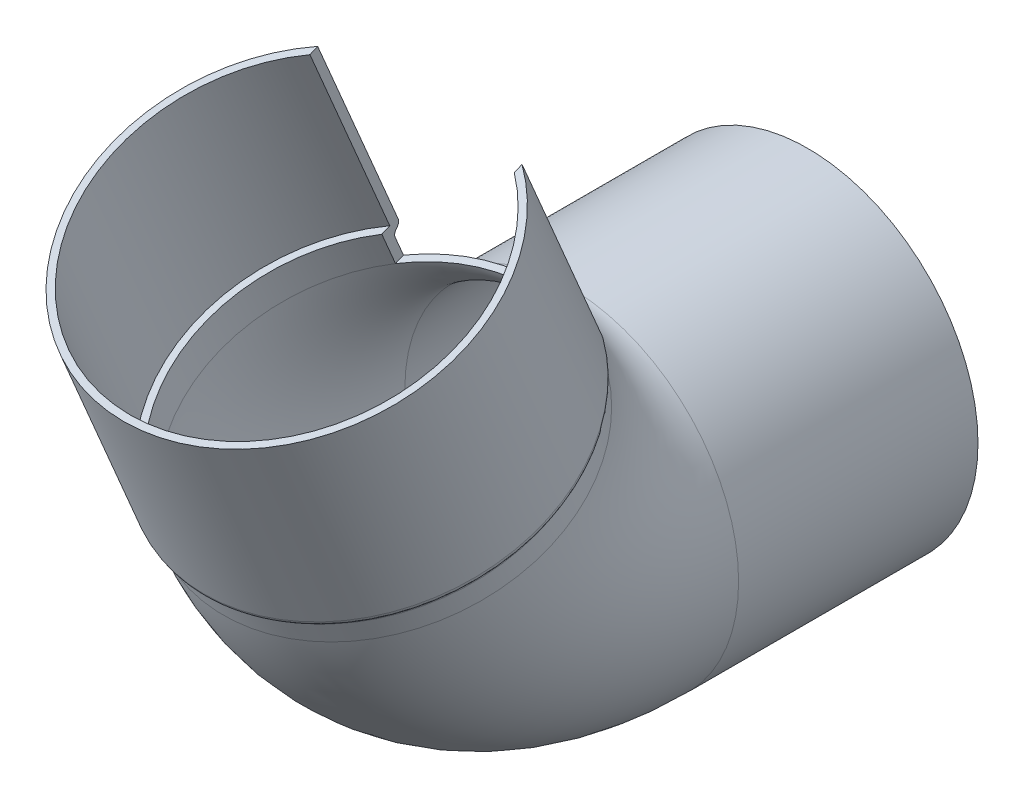
ISO-10303-21;
HEADER;
FILE_DESCRIPTION(('STEP AP214'),'2;1');
FILE_NAME('part.step','',(''),(''),'','','');
FILE_SCHEMA(('AUTOMOTIVE_DESIGN { 1 0 10303 214 1 1 1 1 }'));
ENDSEC;
DATA;
#1=APPLICATION_CONTEXT('core data for automotive mechanical design processes');
#2=APPLICATION_PROTOCOL_DEFINITION('international standard','automotive_design',2000,#1);
#3=PRODUCT_CONTEXT('',#1,'mechanical');
#4=PRODUCT('Part','Part','',(#3));
#5=PRODUCT_RELATED_PRODUCT_CATEGORY('part','',(#4));
#6=PRODUCT_DEFINITION_FORMATION('','',#4);
#7=PRODUCT_DEFINITION_CONTEXT('part definition',#1,'design');
#8=PRODUCT_DEFINITION('design','',#6,#7);
#9=PRODUCT_DEFINITION_SHAPE('','',#8);
#10=(LENGTH_UNIT() NAMED_UNIT(*) SI_UNIT(.MILLI.,.METRE.));
#11=(NAMED_UNIT(*) PLANE_ANGLE_UNIT() SI_UNIT($,.RADIAN.));
#12=(NAMED_UNIT(*) SI_UNIT($,.STERADIAN.) SOLID_ANGLE_UNIT());
#13=UNCERTAINTY_MEASURE_WITH_UNIT(LENGTH_MEASURE(1.E-05),#10,'distance_accuracy_value','');
#14=(GEOMETRIC_REPRESENTATION_CONTEXT(3) GLOBAL_UNCERTAINTY_ASSIGNED_CONTEXT((#13)) GLOBAL_UNIT_ASSIGNED_CONTEXT((#10,
#11,#12)) REPRESENTATION_CONTEXT('',''));
#15=CARTESIAN_POINT('',(0.,0.,0.));
#16=DIRECTION('',(0.,0.,1.));
#17=DIRECTION('',(1.,0.,0.));
#18=AXIS2_PLACEMENT_3D('',#15,#16,#17);
#19=CARTESIAN_POINT('',(0.,18.2780661453218,62.7585787677024));
#20=DIRECTION('',(0.,0.920504853452442,0.390731128489271));
#21=DIRECTION('',(0.,-0.390731128489271,0.920504853452442));
#22=AXIS2_PLACEMENT_3D('',#19,#20,#21);
#23=CYLINDRICAL_SURFACE('',#22,25.);
#24=CARTESIAN_POINT('',(0.,21.1716116294062,63.9868159552533));
#25=DIRECTION('',(0.,0.920504853452441,0.390731128489272));
#26=DIRECTION('',(0.,-0.390731128489272,0.920504853452441));
#27=AXIS2_PLACEMENT_3D('',#24,#25,#26);
#28=CIRCLE('',#27,25.);
#29=CARTESIAN_POINT('',(15.,28.9862341991916,45.5767188862044));
#30=VERTEX_POINT('',#29);
#31=CARTESIAN_POINT('',(-15.,28.9862341991877,45.5767188862139));
#32=VERTEX_POINT('',#31);
#33=EDGE_CURVE('E174',#30,#32,#28,.F.);
#34=ORIENTED_EDGE('',*,*,#33,.T.);
#35=DIRECTION('',(0.,0.920504853452442,0.390731128489271));
#36=VECTOR('',#35,1.);
#37=CARTESIAN_POINT('',(-15.,26.0926887151073,44.3484816986536));
#38=LINE('',#37,#36);
#39=CARTESIAN_POINT('',(-15.,26.0926887151073,44.3484816986536));
#40=VERTEX_POINT('',#39);
#41=EDGE_CURVE('E269',#32,#40,#38,.F.);
#42=ORIENTED_EDGE('',*,*,#41,.T.);
#43=CARTESIAN_POINT('',(0.,18.2780661453218,62.7585787677024));
#44=DIRECTION('',(0.,0.920504853452441,0.390731128489272));
#45=DIRECTION('',(1.,0.,0.));
#46=AXIS2_PLACEMENT_3D('',#43,#44,#45);
#47=CIRCLE('',#46,25.);
#48=CARTESIAN_POINT('',(15.,26.0926887151073,44.3484816986536));
#49=VERTEX_POINT('',#48);
#50=EDGE_CURVE('E167',#40,#49,#47,.T.);
#51=ORIENTED_EDGE('',*,*,#50,.T.);
#52=DIRECTION('',(0.,0.920504853452442,0.390731128489271));
#53=VECTOR('',#52,1.);
#54=CARTESIAN_POINT('',(15.,26.0926887151073,44.3484816986536));
#55=LINE('',#54,#53);
#56=EDGE_CURVE('E128',#49,#30,#55,.T.);
#57=ORIENTED_EDGE('',*,*,#56,.T.);
#58=EDGE_LOOP('',(#34,#42,#51,#57));
#59=FACE_BOUND('',#58,.T.);
#60=ADVANCED_FACE('F45',(#59),#23,.T.);
#61=CARTESIAN_POINT('',(0.,18.2780661453218,62.7585787677024));
#62=DIRECTION('',(0.,0.920504853452442,0.390731128489271));
#63=DIRECTION('',(0.,-0.390731128489271,0.920504853452442));
#64=AXIS2_PLACEMENT_3D('',#61,#62,#63);
#65=CYLINDRICAL_SURFACE('',#64,24.);
#66=DIRECTION('',(0.,0.920504853452442,0.390731128489271));
#67=VECTOR('',#66,1.);
#68=CARTESIAN_POINT('',(-15.,25.5984114913042,45.5129258657229));
#69=LINE('',#68,#67);
#70=CARTESIAN_POINT('',(-15.,30.3329666822934,47.5226253102523));
#71=VERTEX_POINT('',#70);
#72=CARTESIAN_POINT('',(-15.,25.5984114913042,45.5129258657229));
#73=VERTEX_POINT('',#72);
#74=EDGE_CURVE('E144',#71,#73,#69,.F.);
#75=ORIENTED_EDGE('',*,*,#74,.F.);
#76=CARTESIAN_POINT('',(0.,23.012621336311,64.7682782122318));
#77=DIRECTION('',(0.,0.920504853452441,0.390731128489272));
#78=DIRECTION('',(0.,-0.390731128489272,0.920504853452441));
#79=AXIS2_PLACEMENT_3D('',#76,#77,#78);
#80=CIRCLE('',#79,24.);
#81=CARTESIAN_POINT('',(15.,30.3329666822934,47.5226253102523));
#82=VERTEX_POINT('',#81);
#83=EDGE_CURVE('E146',#71,#82,#80,.T.);
#84=ORIENTED_EDGE('',*,*,#83,.T.);
#85=DIRECTION('',(0.,0.920504853452442,0.390731128489271));
#86=VECTOR('',#85,1.);
#87=CARTESIAN_POINT('',(15.,25.5984114913042,45.5129258657229));
#88=LINE('',#87,#86);
#89=CARTESIAN_POINT('',(15.,25.5984114913042,45.5129258657229));
#90=VERTEX_POINT('',#89);
#91=EDGE_CURVE('E214',#90,#82,#88,.T.);
#92=ORIENTED_EDGE('',*,*,#91,.F.);
#93=CARTESIAN_POINT('',(0.,18.2780661453218,62.7585787677024));
#94=DIRECTION('',(0.,0.920504853452442,0.390731128489271));
#95=DIRECTION('',(0.,-0.390731128489271,0.920504853452442));
#96=AXIS2_PLACEMENT_3D('',#93,#94,#95);
#97=CIRCLE('',#96,24.);
#98=EDGE_CURVE('E158',#73,#90,#97,.T.);
#99=ORIENTED_EDGE('',*,*,#98,.F.);
#100=EDGE_LOOP('',(#75,#84,#92,#99));
#101=FACE_BOUND('',#100,.T.);
#102=ADVANCED_FACE('F229',(#101),#65,.F.);
#103=CARTESIAN_POINT('',(0.,23.012621336311,64.7682782122318));
#104=DIRECTION('',(0.,0.920504853452441,0.390731128489272));
#105=DIRECTION('',(0.,-0.390731128489272,0.920504853452441));
#106=AXIS2_PLACEMENT_3D('',#103,#104,#105);
#107=PLANE('',#106);
#108=ORIENTED_EDGE('',*,*,#83,.F.);
#109=DIRECTION('',(0.,0.390731128489272,-0.920504853452441));
#110=VECTOR('',#109,1.);
#111=CARTESIAN_POINT('',(-15.,23.012621336311,64.7682782122318));
#112=LINE('',#111,#110);
#113=CARTESIAN_POINT('',(-15.,30.8272439060965,46.3581811431829));
#114=VERTEX_POINT('',#113);
#115=EDGE_CURVE('E72',#71,#114,#112,.T.);
#116=ORIENTED_EDGE('',*,*,#115,.T.);
#117=CARTESIAN_POINT('',(0.,23.0126213363111,64.7682782122318));
#118=DIRECTION('',(0.,0.920504853452441,0.390731128489272));
#119=DIRECTION('',(0.,-0.390731128489272,0.920504853452441));
#120=AXIS2_PLACEMENT_3D('',#117,#118,#119);
#121=CIRCLE('',#120,25.);
#122=CARTESIAN_POINT('',(15.,30.8272439060965,46.3581811431829));
#123=VERTEX_POINT('',#122);
#124=EDGE_CURVE('E172',#123,#114,#121,.F.);
#125=ORIENTED_EDGE('',*,*,#124,.F.);
#126=DIRECTION('',(0.,-0.390731128489272,0.920504853452441));
#127=VECTOR('',#126,1.);
#128=CARTESIAN_POINT('',(15.,23.012621336311,64.7682782122318));
#129=LINE('',#128,#127);
#130=EDGE_CURVE('E123',#123,#82,#129,.T.);
#131=ORIENTED_EDGE('',*,*,#130,.T.);
#132=EDGE_LOOP('',(#108,#116,#125,#131));
#133=FACE_BOUND('',#132,.T.);
#134=ADVANCED_FACE('F226',(#133),#107,.T.);
#135=CARTESIAN_POINT('',(0.,23.012621336311,64.7682782122318));
#136=DIRECTION('',(0.,-0.920504853452441,-0.390731128489272));
#137=DIRECTION('',(0.,0.390731128489272,-0.920504853452441));
#138=AXIS2_PLACEMENT_3D('',#135,#136,#137);
#139=CYLINDRICAL_SURFACE('',#138,26.);
#140=DIRECTION('',(0.,-0.920504853452441,-0.390731128489272));
#141=VECTOR('',#140,1.);
#142=CARTESIAN_POINT('',(-15.,31.3104847638143,45.2197370252658));
#143=LINE('',#142,#141);
#144=CARTESIAN_POINT('',(-15.,31.0638362317032,45.1150409349294));
#145=VERTEX_POINT('',#144);
#146=CARTESIAN_POINT('',(-15.,58.9256303673876,56.941670879944));
#147=VERTEX_POINT('',#146);
#148=EDGE_CURVE('E213',#145,#147,#143,.F.);
#149=ORIENTED_EDGE('',*,*,#148,.F.);
#150=CARTESIAN_POINT('',(0.,22.7659728042,64.6635821218956));
#151=DIRECTION('',(0.,-0.920504853452441,-0.390731128489272));
#152=DIRECTION('',(0.,0.390731128489272,-0.920504853452441));
#153=AXIS2_PLACEMENT_3D('',#150,#151,#152);
#154=CIRCLE('',#153,26.);
#155=CARTESIAN_POINT('',(15.,31.0638362317032,45.1150409349296));
#156=VERTEX_POINT('',#155);
#157=EDGE_CURVE('E177',#145,#156,#154,.F.);
#158=ORIENTED_EDGE('',*,*,#157,.T.);
#159=DIRECTION('',(0.,-0.920504853452441,-0.390731128489272));
#160=VECTOR('',#159,1.);
#161=CARTESIAN_POINT('',(15.,31.3104847638143,45.2197370252658));
#162=LINE('',#161,#160);
#163=CARTESIAN_POINT('',(15.,58.9256303673876,56.941670879944));
#164=VERTEX_POINT('',#163);
#165=EDGE_CURVE('E64',#164,#156,#162,.T.);
#166=ORIENTED_EDGE('',*,*,#165,.F.);
#167=CARTESIAN_POINT('',(0.,50.6277669398843,76.4902120669099));
#168=DIRECTION('',(0.,0.920504853452441,0.390731128489272));
#169=DIRECTION('',(0.,-0.390731128489272,0.920504853452441));
#170=AXIS2_PLACEMENT_3D('',#167,#168,#169);
#171=CIRCLE('',#170,26.);
#172=EDGE_CURVE('E137',#147,#164,#171,.T.);
#173=ORIENTED_EDGE('',*,*,#172,.F.);
#174=EDGE_LOOP('',(#149,#158,#166,#173));
#175=FACE_BOUND('',#174,.T.);
#176=ADVANCED_FACE('F225',(#175),#139,.T.);
#177=CARTESIAN_POINT('',(0.,50.6277669398843,76.4902120669099));
#178=DIRECTION('',(0.,0.920504853452441,0.390731128489272));
#179=DIRECTION('',(0.,-0.390731128489272,0.920504853452441));
#180=AXIS2_PLACEMENT_3D('',#177,#178,#179);
#181=PLANE('',#180);
#182=CARTESIAN_POINT('',(0.,50.6277669398843,76.4902120669099));
#183=DIRECTION('',(0.,0.920504853452441,0.390731128489272));
#184=DIRECTION('',(1.,0.,0.));
#185=AXIS2_PLACEMENT_3D('',#182,#183,#184);
#186=CIRCLE('',#185,25.);
#187=CARTESIAN_POINT('',(-15.,58.4423895096698,58.0801149978611));
#188=VERTEX_POINT('',#187);
#189=CARTESIAN_POINT('',(15.,58.4423895096698,58.0801149978611));
#190=VERTEX_POINT('',#189);
#191=EDGE_CURVE('E135',#188,#190,#186,.T.);
#192=ORIENTED_EDGE('',*,*,#191,.F.);
#193=DIRECTION('',(0.,0.390731128489275,-0.92050485345244));
#194=VECTOR('',#193,1.);
#195=CARTESIAN_POINT('',(-15.,54.7803663096262,66.7073010173853));
#196=LINE('',#195,#194);
#197=EDGE_CURVE('E139',#188,#147,#196,.T.);
#198=ORIENTED_EDGE('',*,*,#197,.T.);
#199=ORIENTED_EDGE('',*,*,#172,.T.);
#200=DIRECTION('',(0.,0.390731128489275,-0.92050485345244));
#201=VECTOR('',#200,1.);
#202=CARTESIAN_POINT('',(15.,54.7803663096262,66.7073010173853));
#203=LINE('',#202,#201);
#204=EDGE_CURVE('E121',#190,#164,#203,.T.);
#205=ORIENTED_EDGE('',*,*,#204,.F.);
#206=EDGE_LOOP('',(#192,#198,#199,#205));
#207=FACE_BOUND('',#206,.T.);
#208=ADVANCED_FACE('F133',(#207),#181,.T.);
#209=CARTESIAN_POINT('',(0.,50.6277669398843,76.4902120669099));
#210=DIRECTION('',(0.,-0.920504853452441,-0.390731128489272));
#211=DIRECTION('',(0.,0.390731128489272,-0.920504853452441));
#212=AXIS2_PLACEMENT_3D('',#209,#210,#211);
#213=CYLINDRICAL_SURFACE('',#212,25.);
#214=ORIENTED_EDGE('',*,*,#124,.T.);
#215=DIRECTION('',(0.,-0.920504853452441,-0.390731128489272));
#216=VECTOR('',#215,1.);
#217=CARTESIAN_POINT('',(-15.,58.4423895096697,58.0801149978611));
#218=LINE('',#217,#216);
#219=EDGE_CURVE('E143',#114,#188,#218,.F.);
#220=ORIENTED_EDGE('',*,*,#219,.T.);
#221=ORIENTED_EDGE('',*,*,#191,.T.);
#222=DIRECTION('',(0.,-0.920504853452441,-0.390731128489272));
#223=VECTOR('',#222,1.);
#224=CARTESIAN_POINT('',(15.,58.4423895096697,58.0801149978611));
#225=LINE('',#224,#223);
#226=EDGE_CURVE('E118',#190,#123,#225,.T.);
#227=ORIENTED_EDGE('',*,*,#226,.T.);
#228=EDGE_LOOP('',(#214,#220,#221,#227));
#229=FACE_BOUND('',#228,.T.);
#230=ADVANCED_FACE('F142',(#229),#213,.F.);
#231=CARTESIAN_POINT('',(0.,21.1716116294062,63.9868159552533));
#232=DIRECTION('',(0.,0.920504853452441,0.390731128489272));
#233=DIRECTION('',(0.,-0.390731128489272,0.920504853452441));
#234=AXIS2_PLACEMENT_3D('',#231,#232,#233);
#235=TOROIDAL_SURFACE('',#234,26.,1.);
#236=CARTESIAN_POINT('',(-15.,29.3880954725294,43.2819525506763));
#237=CARTESIAN_POINT('',(-15.,29.3268864089202,43.2969490462431));
#238=CARTESIAN_POINT('',(-15.,29.2670822243946,43.3178329699167));
#239=CARTESIAN_POINT('',(-15.,29.1519554103276,43.3696357024714));
#240=CARTESIAN_POINT('',(-15.,29.0966424131682,43.4005754029237));
#241=CARTESIAN_POINT('',(-15.,28.9919860868904,43.470501127195));
#242=CARTESIAN_POINT('',(-15.,28.942602604993,43.5094275502109));
#243=CARTESIAN_POINT('',(-15.,28.8499959739223,43.5939416494074));
#244=CARTESIAN_POINT('',(-15.,28.8067710024222,43.6395273469632));
#245=CARTESIAN_POINT('',(-15.,28.7206191350503,43.743638734368));
#246=CARTESIAN_POINT('',(-15.,28.678790411291,43.8030737127849));
#247=CARTESIAN_POINT('',(-15.,28.6043487332566,43.9274729919223));
#248=CARTESIAN_POINT('',(-15.,28.5717422925301,43.9924411587152));
#249=CARTESIAN_POINT('',(-15.,28.5126739243255,44.1349951443584));
#250=CARTESIAN_POINT('',(-15.,28.487531971833,44.2131317908957));
#251=CARTESIAN_POINT('',(-15.,28.4503931168009,44.3725659770754));
#252=CARTESIAN_POINT('',(-15.,28.4384093828253,44.4538665991035));
#253=CARTESIAN_POINT('',(-15.,28.4285900963037,44.618849215725));
#254=CARTESIAN_POINT('',(-15.,28.43101431081,44.7025476875273));
#255=CARTESIAN_POINT('',(-15.,28.4520550566435,44.8678598224831));
#256=CARTESIAN_POINT('',(-15.,28.470630585871,44.9494782265093));
#257=CARTESIAN_POINT('',(-15.,28.5160826504686,45.0801215888739));
#258=CARTESIAN_POINT('',(-15.,28.53805733906,45.13086680906));
#259=CARTESIAN_POINT('',(-15.,28.5899788830562,45.2281359210067));
#260=CARTESIAN_POINT('',(-15.,28.6199204840208,45.2746625680359));
#261=CARTESIAN_POINT('',(-15.,28.6879787524704,45.3619938512116));
#262=CARTESIAN_POINT('',(-15.,28.7261614129349,45.4027476180272));
#263=CARTESIAN_POINT('',(-15.,28.8098010255717,45.475955637507));
#264=CARTESIAN_POINT('',(-15.,28.8552506379611,45.5084181794611));
#265=CARTESIAN_POINT('',(-15.,28.9452442648319,45.5595357348976));
#266=CARTESIAN_POINT('',(-15.,28.9890652014111,45.5794705671144));
#267=CARTESIAN_POINT('',(-15.,29.079557819005,45.6111750239828));
#268=CARTESIAN_POINT('',(-15.,29.1262287474667,45.6229467940696));
#269=CARTESIAN_POINT('',(-15.,29.2182121042076,45.6377811584207));
#270=CARTESIAN_POINT('',(-15.,29.2634535255045,45.6412959279105));
#271=CARTESIAN_POINT('',(-15.,29.3539198126644,45.6412798852836));
#272=CARTESIAN_POINT('',(-15.,29.3991446737734,45.637747739542));
#273=CARTESIAN_POINT('',(-15.,29.4922804430988,45.6236557627622));
#274=CARTESIAN_POINT('',(-15.,29.5401060700703,45.6125414479069));
#275=CARTESIAN_POINT('',(-15.,29.6336740206155,45.5836193958399));
#276=CARTESIAN_POINT('',(-15.,29.6794152628774,45.5658082278559));
#277=CARTESIAN_POINT('',(-15.,29.7757085201597,45.5208589579131));
#278=CARTESIAN_POINT('',(-15.,29.8257599911839,45.4926511034645));
#279=CARTESIAN_POINT('',(-15.,29.9214607819222,45.4295774694993));
#280=CARTESIAN_POINT('',(-15.,29.9671072769903,45.3947074600836));
#281=CARTESIAN_POINT('',(-15.,30.0621204765293,45.3119348973153));
#282=CARTESIAN_POINT('',(-15.,30.1104315720255,45.2628190903912));
#283=CARTESIAN_POINT('',(-15.,30.1995159704869,45.1581760346033));
#284=CARTESIAN_POINT('',(-15.,30.2402846141397,45.1026448568511));
#285=CARTESIAN_POINT('',(-15.,30.3196422648505,44.9772110283431));
#286=CARTESIAN_POINT('',(-15.,30.3568478528493,44.906428547428));
#287=CARTESIAN_POINT('',(-15.,30.4196065070386,44.7598074819775));
#288=CARTESIAN_POINT('',(-15.,30.445149168739,44.6839644517781));
#289=CARTESIAN_POINT('',(-15.,30.484572063707,44.5249024660978));
#290=CARTESIAN_POINT('',(-15.,30.4977482064203,44.441506359725));
#291=CARTESIAN_POINT('',(-15.,30.5085251446044,44.2737255098523));
#292=CARTESIAN_POINT('',(-15.,30.5061504392664,44.1893425303873));
#293=CARTESIAN_POINT('',(-15.,30.4872514814699,44.0450491221082));
#294=CARTESIAN_POINT('',(-15.,30.4746708356819,43.9846152806243));
#295=CARTESIAN_POINT('',(-15.,30.4397919548191,43.866576077784));
#296=CARTESIAN_POINT('',(-15.,30.4174978094649,43.8089695373806));
#297=CARTESIAN_POINT('',(-15.,30.362660905114,43.6981768641));
#298=CARTESIAN_POINT('',(-15.,30.3300325245579,43.6450325319271));
#299=CARTESIAN_POINT('',(-15.,30.254849362628,43.5462790523854));
#300=CARTESIAN_POINT('',(-15.,30.2123060897516,43.5006612727907));
#301=CARTESIAN_POINT('',(-15.,30.1254030720865,43.4255292313677));
#302=CARTESIAN_POINT('',(-15.,30.0822366285554,43.3946322112578));
#303=CARTESIAN_POINT('',(-15.,29.9908500563181,43.3415455484593));
#304=CARTESIAN_POINT('',(-15.,29.9426331992112,43.319350312521));
#305=CARTESIAN_POINT('',(-15.,29.848082959112,43.2863179534317));
#306=CARTESIAN_POINT('',(-15.,29.8020739706959,43.2745406759589));
#307=CARTESIAN_POINT('',(-15.,29.7087639853757,43.2587986514227));
#308=CARTESIAN_POINT('',(-15.,29.6614636359846,43.2548300593176));
#309=CARTESIAN_POINT('',(-15.,29.576116533923,43.2544878981891));
#310=CARTESIAN_POINT('',(-15.,29.5380662628349,43.2567826703193));
#311=CARTESIAN_POINT('',(-15.,29.4625383283764,43.2659864952749));
#312=CARTESIAN_POINT('',(-15.,29.4250607091044,43.2728959016486));
#313=CARTESIAN_POINT('',(-15.,29.3880954725294,43.2819525506763));
#314=B_SPLINE_CURVE_WITH_KNOTS('',3,(#236,#237,#238,#239,#240,#241,#242,#243,#244,#245,#246,
#247,#248,#249,#250,#251,#252,#253,#254,#255,#256,#257,#258,#259,#260,#261,#262,#263,#264,#265,
#266,#267,#268,#269,#270,#271,#272,#273,#274,#275,#276,#277,#278,#279,#280,#281,#282,#283,#284,
#285,#286,#287,#288,#289,#290,#291,#292,#293,#294,#295,#296,#297,#298,#299,#300,#301,#302,#303,
#304,#305,#306,#307,#308,#309,#310,#311,#312,#313),.UNSPECIFIED.,.T.,.F.,(4,2,2,2,2,2,2,2,2,2,2,
2,2,2,2,2,2,2,2,2,2,2,2,2,2,2,2,2,2,2,2,2,2,2,2,2,2,2,4),(0.,0.188896269623244,
0.378187520142146,0.566114461324348,0.753985678202353,0.971161389304395,1.18849010721688,
1.43362570265487,1.67900640344472,1.92882443901498,2.17801012630155,2.34328244363074,
2.50844602747179,2.67498482776548,2.84135647056193,2.98502035894327,3.1286464749174,
3.26420274820743,3.39978467788423,3.54652562219469,3.6933418439869,3.86506827948418,
4.03690411111655,4.24279556010157,4.44881377589362,4.687672932505,4.92674476090421,
5.17872376606053,5.43030589285886,5.61477454658268,5.79916560753525,5.98512621758865,
6.17087204355761,6.32922308093735,6.48747216741677,6.62928741483608,6.77103281411951,
6.88510187340845,6.99917967305137),.UNSPECIFIED.);
#315=CARTESIAN_POINT('',(-15.,30.0262895938524,45.3429247802342));
#316=VERTEX_POINT('',#315);
#317=EDGE_CURVE('E208',#32,#316,#314,.T.);
#318=ORIENTED_EDGE('',*,*,#317,.F.);
#319=ORIENTED_EDGE('',*,*,#33,.F.);
#320=CARTESIAN_POINT('',(15.,29.3880954725294,43.2819525506763));
#321=CARTESIAN_POINT('',(15.,29.4365058938397,43.270098130097));
#322=CARTESIAN_POINT('',(15.,29.4858563837515,43.2619058364185));
#323=CARTESIAN_POINT('',(15.,29.5853076781158,43.2536273586135));
#324=CARTESIAN_POINT('',(15.,29.6354093151731,43.2535509559683));
#325=CARTESIAN_POINT('',(15.,29.7350796329515,43.2620253314976));
#326=CARTESIAN_POINT('',(15.,29.7846458808204,43.2706058529263));
#327=CARTESIAN_POINT('',(15.,29.8814318775703,43.2964839893637));
#328=CARTESIAN_POINT('',(15.,29.9286529896668,43.3137764734231));
#329=CARTESIAN_POINT('',(15.,30.0167666007028,43.3554195578513));
#330=CARTESIAN_POINT('',(15.,30.0578628122469,43.3793410075945));
#331=CARTESIAN_POINT('',(15.,30.135472967542,43.4337113865447));
#332=CARTESIAN_POINT('',(15.,30.1719865141043,43.464160880932));
#333=CARTESIAN_POINT('',(15.,30.2398654937838,43.5307212225868));
#334=CARTESIAN_POINT('',(15.,30.2711958816937,43.566867619399));
#335=CARTESIAN_POINT('',(15.,30.3279911951407,43.6434897199513));
#336=CARTESIAN_POINT('',(15.,30.3534544703287,43.6839666371383));
#337=CARTESIAN_POINT('',(15.,30.4006480043252,43.7723621707177));
#338=CARTESIAN_POINT('',(15.,30.4217413589566,43.820619483871));
#339=CARTESIAN_POINT('',(15.,30.4567679346373,43.919652456206));
#340=CARTESIAN_POINT('',(15.,30.470697489224,43.9704293903925));
#341=CARTESIAN_POINT('',(15.,30.4933539989267,44.0815765638548));
#342=CARTESIAN_POINT('',(15.,30.5008994142799,44.1421869660966));
#343=CARTESIAN_POINT('',(15.,30.507328268223,44.2638548246373));
#344=CARTESIAN_POINT('',(15.,30.506206467985,44.3249125290282));
#345=CARTESIAN_POINT('',(15.,30.4949849714974,44.4569095916634));
#346=CARTESIAN_POINT('',(15.,30.4833573705916,44.5277201526049));
#347=CARTESIAN_POINT('',(15.,30.449839264726,44.6668660903498));
#348=CARTESIAN_POINT('',(15.,30.4279431294591,44.735200087065));
#349=CARTESIAN_POINT('',(15.,30.3710541481292,44.8769482051375));
#350=CARTESIAN_POINT('',(15.,30.3347019236311,44.9498204648719));
#351=CARTESIAN_POINT('',(15.,30.2506211878156,45.088786221373));
#352=CARTESIAN_POINT('',(15.,30.2028810622284,45.1548726983923));
#353=CARTESIAN_POINT('',(15.,30.095241114652,45.2799265536834));
#354=CARTESIAN_POINT('',(15.,30.0350140784006,45.3386144128015));
#355=CARTESIAN_POINT('',(15.,29.9044777199012,45.4433981465204));
#356=CARTESIAN_POINT('',(15.,29.8341917333132,45.489522467367));
#357=CARTESIAN_POINT('',(15.,29.7095042378253,45.5531790038062));
#358=CARTESIAN_POINT('',(15.,29.6573465778381,45.5751325797519));
#359=CARTESIAN_POINT('',(15.,29.5501271131591,45.6102944304191));
#360=CARTESIAN_POINT('',(15.,29.4950670680327,45.623507939427));
#361=CARTESIAN_POINT('',(15.,29.3829196947791,45.6399027905382));
#362=CARTESIAN_POINT('',(15.,29.3258187806146,45.6429947312425));
#363=CARTESIAN_POINT('',(15.,29.2121317597183,45.6377789793493));
#364=CARTESIAN_POINT('',(15.,29.1555451374319,45.6294843637945));
#365=CARTESIAN_POINT('',(15.,29.0533542893737,45.6032693125742));
#366=CARTESIAN_POINT('',(15.,29.0073451269052,45.5869140678727));
#367=CARTESIAN_POINT('',(15.,28.9190747585823,45.5461160925231));
#368=CARTESIAN_POINT('',(15.,28.876812245622,45.5216761965851));
#369=CARTESIAN_POINT('',(15.,28.8001137829683,45.467683378477));
#370=CARTESIAN_POINT('',(15.,28.765336408028,45.4386110631494));
#371=CARTESIAN_POINT('',(15.,28.7007684528906,45.3753944739829));
#372=CARTESIAN_POINT('',(15.,28.670978651961,45.3412494091386));
#373=CARTESIAN_POINT('',(15.,28.6147639506739,45.2664059060911));
#374=CARTESIAN_POINT('',(15.,28.5887328936683,45.2254132500942));
#375=CARTESIAN_POINT('',(15.,28.542812883258,45.1401363823095));
#376=CARTESIAN_POINT('',(15.,28.5229269501264,45.0958505651863));
#377=CARTESIAN_POINT('',(15.,28.4863628848506,44.9976045862627));
#378=CARTESIAN_POINT('',(15.,28.4707478604001,44.9432500300434));
#379=CARTESIAN_POINT('',(15.,28.4472049064829,44.8329129122576));
#380=CARTESIAN_POINT('',(15.,28.4392818572848,44.7769293403082));
#381=CARTESIAN_POINT('',(15.,28.4298137370907,44.6532534103879));
#382=CARTESIAN_POINT('',(15.,28.4298441094421,44.5854396807634));
#383=CARTESIAN_POINT('',(15.,28.4395646936834,44.4505134966278));
#384=CARTESIAN_POINT('',(15.,28.4492609460869,44.3834015071578));
#385=CARTESIAN_POINT('',(15.,28.480088884571,44.2401400962994));
#386=CARTESIAN_POINT('',(15.,28.5028503096043,44.1643376203768));
#387=CARTESIAN_POINT('',(15.,28.5599764159507,44.0171855353535));
#388=CARTESIAN_POINT('',(15.,28.5943501816461,43.9458394644541));
#389=CARTESIAN_POINT('',(15.,28.6767025966711,43.805083925009));
#390=CARTESIAN_POINT('',(15.,28.725423072241,43.736105142874));
#391=CARTESIAN_POINT('',(15.,28.8346086249253,43.6080920681412));
#392=CARTESIAN_POINT('',(15.,28.8950657120836,43.549051060951));
#393=CARTESIAN_POINT('',(15.,29.0097770917419,43.457536911843));
#394=CARTESIAN_POINT('',(15.,29.0616991565877,43.4221256446733));
#395=CARTESIAN_POINT('',(15.,29.1705235943814,43.3603079898186));
#396=CARTESIAN_POINT('',(15.,29.2274074158559,43.3338697261115));
#397=CARTESIAN_POINT('',(15.,29.3195704917328,43.3007094618406));
#398=CARTESIAN_POINT('',(15.,29.3535942444699,43.2904009809284));
#399=CARTESIAN_POINT('',(15.,29.3880954725294,43.2819525506763));
#400=B_SPLINE_CURVE_WITH_KNOTS('',3,(#320,#321,#322,#323,#324,#325,#326,#327,#328,#329,#330,
#331,#332,#333,#334,#335,#336,#337,#338,#339,#340,#341,#342,#343,#344,#345,#346,#347,#348,#349,
#350,#351,#352,#353,#354,#355,#356,#357,#358,#359,#360,#361,#362,#363,#364,#365,#366,#367,#368,
#369,#370,#371,#372,#373,#374,#375,#376,#377,#378,#379,#380,#381,#382,#383,#384,#385,#386,#387,
#388,#389,#390,#391,#392,#393,#394,#395,#396,#397,#398,#399),.UNSPECIFIED.,.T.,.F.,(4,2,2,2,2,2,
2,2,2,2,2,2,2,2,2,2,2,2,2,2,2,2,2,2,2,2,2,2,2,2,2,2,2,2,2,2,2,2,2,4),(0.,0.14942654389602,
0.299033178480476,0.449155584370396,0.599189678178209,0.741162505058931,0.883147628524931,
1.02605665957352,1.1690058402944,1.32639479898118,1.48386423002508,1.66640681990278,
1.84905975479257,2.06348822523716,2.2780344059793,2.52125820449879,2.76473113026239,
3.01564983426069,3.26599559655946,3.43512748874175,3.60415799860232,3.77467754256173,
3.94500141482431,4.09069838251765,4.23634431873659,4.37174492499497,4.50716666678228,
4.6522881058079,4.79748075768738,4.96651746307514,5.13566134593713,5.33833105723053,
5.54112750267225,5.7775547667977,6.01416741891855,6.26623088162419,6.51812334456428,
6.70596027459519,6.89312276510727,6.99961634912421),.UNSPECIFIED.);
#401=CARTESIAN_POINT('',(15.,30.0262895938525,45.3429247802342));
#402=VERTEX_POINT('',#401);
#403=EDGE_CURVE('E192',#402,#30,#400,.T.);
#404=ORIENTED_EDGE('',*,*,#403,.F.);
#405=CARTESIAN_POINT('',(0.,21.9687922168027,64.3251990385743));
#406=DIRECTION('',(0.,-0.920504853452441,-0.390731128489272));
#407=DIRECTION('',(0.,0.390731128489272,-0.920504853452441));
#408=AXIS2_PLACEMENT_3D('',#405,#406,#407);
#409=CIRCLE('',#408,25.5000000000003);
#410=EDGE_CURVE('E180',#402,#316,#409,.T.);
#411=ORIENTED_EDGE('',*,*,#410,.T.);
#412=EDGE_LOOP('',(#318,#319,#404,#411));
#413=FACE_BOUND('',#412,.T.);
#414=ADVANCED_FACE('F200',(#413),#235,.F.);
#415=CARTESIAN_POINT('',(0.,22.7659728042,64.6635821218956));
#416=DIRECTION('',(0.,-0.920504853452441,-0.390731128489272));
#417=DIRECTION('',(0.,0.390731128489272,-0.920504853452441));
#418=AXIS2_PLACEMENT_3D('',#415,#416,#417);
#419=TOROIDAL_SURFACE('',#418,25.0000000000002,1.);
#420=ORIENTED_EDGE('',*,*,#157,.F.);
#421=CARTESIAN_POINT('',(-15.,29.8895820606754,45.4851184133137));
#422=CARTESIAN_POINT('',(-15.,29.8352911314168,45.5502276386106));
#423=CARTESIAN_POINT('',(-15.,29.7867399409022,45.6202140589219));
#424=CARTESIAN_POINT('',(-15.,29.7017743661688,45.7673985633598));
#425=CARTESIAN_POINT('',(-15.,29.6653988913828,45.8446187768222));
#426=CARTESIAN_POINT('',(-15.,29.6055401342533,46.0040983607104));
#427=CARTESIAN_POINT('',(-15.,29.5820842831131,46.0863680440717));
#428=CARTESIAN_POINT('',(-15.,29.5491203200939,46.2536132962727));
#429=CARTESIAN_POINT('',(-15.,29.5395964696836,46.3385857008429));
#430=CARTESIAN_POINT('',(-15.,29.5360418326269,46.4945656970825));
#431=CARTESIAN_POINT('',(-15.,29.5396767661523,46.5655208239306));
#432=CARTESIAN_POINT('',(-15.,29.5583930807292,46.7059296729182));
#433=CARTESIAN_POINT('',(-15.,29.5734616410776,46.7753849871703));
#434=CARTESIAN_POINT('',(-15.,29.6116147051366,46.8963973771082));
#435=CARTESIAN_POINT('',(-15.,29.6323907659445,46.9486806512788));
#436=CARTESIAN_POINT('',(-15.,29.6821621681834,47.0491922412166));
#437=CARTESIAN_POINT('',(-15.,29.7111478140468,47.0974252537655));
#438=CARTESIAN_POINT('',(-15.,29.7722517661079,47.1808397975684));
#439=CARTESIAN_POINT('',(-15.,29.8031870411293,47.2168853391834));
#440=CARTESIAN_POINT('',(-15.,29.8706452767599,47.2833228247151));
#441=CARTESIAN_POINT('',(-15.,29.9071652351567,47.3137177869313));
#442=CARTESIAN_POINT('',(-15.,29.9851895943262,47.3676881712978));
#443=CARTESIAN_POINT('',(-15.,30.026714272307,47.3912344352338));
#444=CARTESIAN_POINT('',(-15.,30.113360119464,47.4303626713942));
#445=CARTESIAN_POINT('',(-15.,30.1584808019086,47.4459457193585));
#446=CARTESIAN_POINT('',(-15.,30.247462650564,47.4679461586984));
#447=CARTESIAN_POINT('',(-15.,30.2911840268815,47.4749381288072));
#448=CARTESIAN_POINT('',(-15.,30.3791647285338,47.4818879981573));
#449=CARTESIAN_POINT('',(-15.,30.4234241045998,47.481845228826));
#450=CARTESIAN_POINT('',(-15.,30.5139223455718,47.4750239424129));
#451=CARTESIAN_POINT('',(-15.,30.5601313820494,47.4678641415724));
#452=CARTESIAN_POINT('',(-15.,30.6510460653898,47.4470248032059));
#453=CARTESIAN_POINT('',(-15.,30.6957506133963,47.4333406064458));
#454=CARTESIAN_POINT('',(-15.,30.8016758310612,47.3931944808021));
#455=CARTESIAN_POINT('',(-15.,30.8617799540378,47.3637705904824));
#456=CARTESIAN_POINT('',(-15.,30.9763869328924,47.2955233082253));
#457=CARTESIAN_POINT('',(-15.,31.0308811238297,47.2566856774698));
#458=CARTESIAN_POINT('',(-15.,31.1342294076029,47.1708850615877));
#459=CARTESIAN_POINT('',(-15.,31.1829993524306,47.1238213846713));
#460=CARTESIAN_POINT('',(-15.,31.2735618411717,47.0234687239285));
#461=CARTESIAN_POINT('',(-15.,31.3153557817708,46.9701809898787));
#462=CARTESIAN_POINT('',(-15.,31.3994749708396,46.8470413811829));
#463=CARTESIAN_POINT('',(-15.,31.4401280252687,46.7760412297548));
#464=CARTESIAN_POINT('',(-15.,31.5099665632064,46.6285171051061));
#465=CARTESIAN_POINT('',(-15.,31.5391374787736,46.5519862595253));
#466=CARTESIAN_POINT('',(-15.,31.5866669311102,46.3894019382383));
#467=CARTESIAN_POINT('',(-15.,31.6040628897347,46.3030631977464));
#468=CARTESIAN_POINT('',(-15.,31.622801573866,46.1286586027782));
#469=CARTESIAN_POINT('',(-15.,31.6241673879396,46.0405954153639));
#470=CARTESIAN_POINT('',(-15.,31.611139812537,45.8900632029154));
#471=CARTESIAN_POINT('',(-15.,31.6009796515598,45.8272197305194));
#472=CARTESIAN_POINT('',(-15.,31.5705845758469,45.7040173397127));
#473=CARTESIAN_POINT('',(-15.,31.5503636210531,45.6436551037345));
#474=CARTESIAN_POINT('',(-15.,31.5034926060156,45.5369382875567));
#475=CARTESIAN_POINT('',(-15.,31.4784107186892,45.4898968995301));
#476=CARTESIAN_POINT('',(-15.,31.4207947118465,45.4005826085697));
#477=CARTESIAN_POINT('',(-15.,31.3882629819952,45.3583081830264));
#478=CARTESIAN_POINT('',(-15.,31.3159125422879,45.2799867223516));
#479=CARTESIAN_POINT('',(-15.,31.2760496471598,45.2439801737698));
#480=CARTESIAN_POINT('',(-15.,31.1901866474786,45.1802283045594));
#481=CARTESIAN_POINT('',(-15.,31.1441905212075,45.1524776661735));
#482=CARTESIAN_POINT('',(-15.,31.053065080975,45.1090677987148));
#483=CARTESIAN_POINT('',(-15.,31.0084102969218,45.0924057929461));
#484=CARTESIAN_POINT('',(-15.,30.9169065981268,45.0670348782971));
#485=CARTESIAN_POINT('',(-15.,30.8700580068326,45.0583248008685));
#486=CARTESIAN_POINT('',(-15.,30.776672123595,45.0489378023928));
#487=CARTESIAN_POINT('',(-15.,30.7301522733386,45.0480814790115));
#488=CARTESIAN_POINT('',(-15.,30.6375517185251,45.0535325764785));
#489=CARTESIAN_POINT('',(-15.,30.591471090546,45.0598412243006));
#490=CARTESIAN_POINT('',(-15.,30.4966788481207,45.0798522966221));
#491=CARTESIAN_POINT('',(-15.,30.4480965421712,45.0941610604911));
#492=CARTESIAN_POINT('',(-15.,30.3534848251489,45.1296007835527));
#493=CARTESIAN_POINT('',(-15.,30.3074575034977,45.1507372327269));
#494=CARTESIAN_POINT('',(-15.,30.2113907236882,45.202799147014));
#495=CARTESIAN_POINT('',(-15.,30.1619124563804,45.234756592422));
#496=CARTESIAN_POINT('',(-15.,30.0679640884912,45.3052253048675));
#497=CARTESIAN_POINT('',(-15.,30.0234903882487,45.3437318106097));
#498=CARTESIAN_POINT('',(-15.,29.9493757167887,45.4167826850656));
#499=CARTESIAN_POINT('',(-15.,29.9186558668887,45.4502512075976));
#500=CARTESIAN_POINT('',(-15.,29.8895820606754,45.4851184133137));
#501=B_SPLINE_CURVE_WITH_KNOTS('',3,(#421,#422,#423,#424,#425,#426,#427,#428,#429,#430,#431,
#432,#433,#434,#435,#436,#437,#438,#439,#440,#441,#442,#443,#444,#445,#446,#447,#448,#449,#450,
#451,#452,#453,#454,#455,#456,#457,#458,#459,#460,#461,#462,#463,#464,#465,#466,#467,#468,#469,
#470,#471,#472,#473,#474,#475,#476,#477,#478,#479,#480,#481,#482,#483,#484,#485,#486,#487,#488,
#489,#490,#491,#492,#493,#494,#495,#496,#497,#498,#499,#500),.UNSPECIFIED.,.T.,.F.,(4,2,2,2,2,2,
2,2,2,2,2,2,2,2,2,2,2,2,2,2,2,2,2,2,2,2,2,2,2,2,2,2,2,2,2,2,2,2,2,4),(0.,0.25416909343761,
0.509142838197902,0.764655881754644,1.01988005697506,1.23222145770806,1.44432510795716,
1.61247168418551,1.78042050050051,1.92232216524882,2.06414781298661,2.20656872708776,
2.34897039665641,2.48121294470445,2.6134680609216,2.7532123034228,2.89305649059525,
3.09273012114279,3.29270767504338,3.4953306844547,3.69791307734726,3.94232536123572,
4.18704675083018,4.44992153905891,4.71241765645598,4.90267946582516,5.09267800894826,
5.25195567050702,5.41118231240521,5.57140209408537,5.73151845121565,5.87379302156212,
6.01604668107012,6.15504253230856,6.29406218964224,6.44541612239406,6.59689205949853,
6.77295173139845,6.94888394737311,7.08499624216923),.UNSPECIFIED.);
#502=EDGE_CURVE('E12',#145,#316,#501,.T.);
#503=ORIENTED_EDGE('',*,*,#502,.T.);
#504=ORIENTED_EDGE('',*,*,#410,.F.);
#505=CARTESIAN_POINT('',(15.,29.8895820606754,45.4851184133137));
#506=CARTESIAN_POINT('',(15.,29.9356505081494,45.4298725792608));
#507=CARTESIAN_POINT('',(15.,29.9859254803752,45.3780490969684));
#508=CARTESIAN_POINT('',(15.,30.0943265457218,45.2832562282637));
#509=CARTESIAN_POINT('',(15.,30.1524551711284,45.2402897089713));
#510=CARTESIAN_POINT('',(15.,30.2641794684605,45.1725178610703));
#511=CARTESIAN_POINT('',(15.,30.3166251475118,45.1458233565123));
#512=CARTESIAN_POINT('',(15.,30.4252026510751,45.1013637308714));
#513=CARTESIAN_POINT('',(15.,30.4813323869775,45.0835935988814));
#514=CARTESIAN_POINT('',(15.,30.5964308602029,45.0583499619503));
#515=CARTESIAN_POINT('',(15.,30.6554199410107,45.0509667723555));
#516=CARTESIAN_POINT('',(15.,30.7737000924418,45.0480852125035));
#517=CARTESIAN_POINT('',(15.,30.8329907556648,45.0525736725904));
#518=CARTESIAN_POINT('',(15.,30.9407065142499,45.0723836540751));
#519=CARTESIAN_POINT('',(15.,30.9894458209835,45.0860123726822));
#520=CARTESIAN_POINT('',(15.,31.0835658100586,45.1220223146881));
#521=CARTESIAN_POINT('',(15.,31.128948240228,45.1443989446093));
#522=CARTESIAN_POINT('',(15.,31.2112492053088,45.1948363220984));
#523=CARTESIAN_POINT('',(15.,31.248558146858,45.2222654774772));
#524=CARTESIAN_POINT('',(15.,31.3182547532175,45.2827719310326));
#525=CARTESIAN_POINT('',(15.,31.3506421224676,45.3158495681702));
#526=CARTESIAN_POINT('',(15.,31.4112081959376,45.3879990494252));
#527=CARTESIAN_POINT('',(15.,31.4391581737459,45.4272618755861));
#528=CARTESIAN_POINT('',(15.,31.4889607569731,45.5094652948423));
#529=CARTESIAN_POINT('',(15.,31.5108108853107,45.5524073728165));
#530=CARTESIAN_POINT('',(15.,31.5509711541008,45.6467542346275));
#531=CARTESIAN_POINT('',(15.,31.5684206910563,45.6985239139817));
#532=CARTESIAN_POINT('',(15.,31.5958655322773,45.8039888949546));
#533=CARTESIAN_POINT('',(15.,31.6058565337039,45.8576852894075));
#534=CARTESIAN_POINT('',(15.,31.6200023198901,45.9758445076377));
#535=CARTESIAN_POINT('',(15.,31.6227502489794,46.0404753720584));
#536=CARTESIAN_POINT('',(15.,31.6191632084502,46.1694711363863));
#537=CARTESIAN_POINT('',(15.,31.6128228547817,46.2338358559651));
#538=CARTESIAN_POINT('',(15.,31.589794506081,46.3729855649319));
#539=CARTESIAN_POINT('',(15.,31.5714066918537,46.4474912224763));
#540=CARTESIAN_POINT('',(15.,31.5238101250284,46.5929936785431));
#541=CARTESIAN_POINT('',(15.,31.4945917287364,46.6639872858404));
#542=CARTESIAN_POINT('',(15.,31.4218156276053,46.8095718558907));
#543=CARTESIAN_POINT('',(15.,31.3769196002166,46.8834982759887));
#544=CARTESIAN_POINT('',(15.,31.2753079793943,47.0227620966741));
#545=CARTESIAN_POINT('',(15.,31.2185966140641,47.0881025561338));
#546=CARTESIAN_POINT('',(15.,31.1062877956698,47.195894193945));
#547=CARTESIAN_POINT('',(15.,31.052591821776,47.2403286830406));
#548=CARTESIAN_POINT('',(15.,30.9387153893532,47.3199385939829));
#549=CARTESIAN_POINT('',(15.,30.8785437895249,47.3551264439424));
#550=CARTESIAN_POINT('',(15.,30.7656370276615,47.4079318157822));
#551=CARTESIAN_POINT('',(15.,30.7138958432212,47.4276705969956));
#552=CARTESIAN_POINT('',(15.,30.6078768262234,47.4584722263554));
#553=CARTESIAN_POINT('',(15.,30.5536018865215,47.4695447241705));
#554=CARTESIAN_POINT('',(15.,30.452134395524,47.4807727096161));
#555=CARTESIAN_POINT('',(15.,30.4050971278421,47.4823136832237));
#556=CARTESIAN_POINT('',(15.,30.3114141703302,47.4775145564208));
#557=CARTESIAN_POINT('',(15.,30.2647682863719,47.4711786280438));
#558=CARTESIAN_POINT('',(15.,30.1731375293421,47.4503327108947));
#559=CARTESIAN_POINT('',(15.,30.1281595301327,47.4357922024961));
#560=CARTESIAN_POINT('',(15.,30.0415689661575,47.3988284726526));
#561=CARTESIAN_POINT('',(15.,29.9999561738434,47.3764057847334));
#562=CARTESIAN_POINT('',(15.,29.9238521914821,47.3262077068702));
#563=CARTESIAN_POINT('',(15.,29.8890774573026,47.2988587260559));
#564=CARTESIAN_POINT('',(15.,29.8242783406861,47.2390415691006));
#565=CARTESIAN_POINT('',(15.,29.7942544997071,47.2065728103006));
#566=CARTESIAN_POINT('',(15.,29.7374806256689,47.1353356160822));
#567=CARTESIAN_POINT('',(15.,29.7110763733553,47.0962931357985));
#568=CARTESIAN_POINT('',(15.,29.6640848798705,47.0148602165233));
#569=CARTESIAN_POINT('',(15.,29.6435020333763,46.9724672789395));
#570=CARTESIAN_POINT('',(15.,29.6002611307617,46.8664070614045));
#571=CARTESIAN_POINT('',(15.,29.5805994940878,46.8015115327142));
#572=CARTESIAN_POINT('',(15.,29.5521151685614,46.6693946012276));
#573=CARTESIAN_POINT('',(15.,29.5433077934102,46.602170049601));
#574=CARTESIAN_POINT('',(15.,29.5356290405409,46.4663154929379));
#575=CARTESIAN_POINT('',(15.,29.5368876436324,46.3976785554958));
#576=CARTESIAN_POINT('',(15.,29.5488805156913,46.2612470817601));
#577=CARTESIAN_POINT('',(15.,29.5596184950666,46.1934528858698));
#578=CARTESIAN_POINT('',(15.,29.5930448038346,46.0463428667125));
#579=CARTESIAN_POINT('',(15.,29.61771261548,45.9674736075378));
#580=CARTESIAN_POINT('',(15.,29.6790846686077,45.8146590222973));
#581=CARTESIAN_POINT('',(15.,29.7157713818501,45.7407067132183));
#582=CARTESIAN_POINT('',(15.,29.7776563663288,45.6377814928071));
#583=CARTESIAN_POINT('',(15.,29.7983817254747,45.6060579564606));
#584=CARTESIAN_POINT('',(15.,29.8422090100416,45.5442787298712));
#585=CARTESIAN_POINT('',(15.,29.8653117729152,45.5142236331233));
#586=CARTESIAN_POINT('',(15.,29.8895820606754,45.4851184133137));
#587=B_SPLINE_CURVE_WITH_KNOTS('',3,(#505,#506,#507,#508,#509,#510,#511,#512,#513,#514,#515,
#516,#517,#518,#519,#520,#521,#522,#523,#524,#525,#526,#527,#528,#529,#530,#531,#532,#533,#534,
#535,#536,#537,#538,#539,#540,#541,#542,#543,#544,#545,#546,#547,#548,#549,#550,#551,#552,#553,
#554,#555,#556,#557,#558,#559,#560,#561,#562,#563,#564,#565,#566,#567,#568,#569,#570,#571,#572,
#573,#574,#575,#576,#577,#578,#579,#580,#581,#582,#583,#584,#585,#586),.UNSPECIFIED.,.T.,.F.,(4,
2,2,2,2,2,2,2,2,2,2,2,2,2,2,2,2,2,2,2,2,2,2,2,2,2,2,2,2,2,2,2,2,2,2,2,2,2,2,2,4),(0.,
0.215680660260993,0.431431030035699,0.607278551372202,0.783027226149188,0.960294799665707,
1.1373658062712,1.28835854460101,1.43927210378199,1.5775691199811,1.71587443819661,
1.85988504869969,2.00395405552758,2.16723469931271,2.33060946727708,2.52395474383487,
2.71741460870484,2.94672510714862,3.17624027910056,3.43452478042779,3.69271701324331,
3.90102818268866,4.10905791884674,4.27456571571677,4.43988896097846,4.58047755442719,
4.72099171626276,4.86203204539741,5.0030628296902,5.13520534208237,5.26736290388939,
5.40822323201036,5.54918961583487,5.75151506395486,5.95412563673154,6.15935667991573,
6.36466809006507,6.61155129685572,6.85807604275775,6.97166315825249,7.08529042324376),.UNSPECIFIED.);
#588=EDGE_CURVE('E57',#402,#156,#587,.T.);
#589=ORIENTED_EDGE('',*,*,#588,.T.);
#590=EDGE_LOOP('',(#420,#503,#504,#589));
#591=FACE_BOUND('',#590,.T.);
#592=ADVANCED_FACE('F47',(#591),#419,.T.);
#593=CARTESIAN_POINT('',(0.,30.,35.1434331641292));
#594=DIRECTION('',(-1.,0.,0.));
#595=DIRECTION('',(0.,0.,1.));
#596=AXIS2_PLACEMENT_3D('',#593,#594,#595);
#597=TOROIDAL_SURFACE('',#596,30.,25.);
#598=CARTESIAN_POINT('',(0.,0.,35.1434331641292));
#599=DIRECTION('',(0.,0.,1.));
#600=DIRECTION('',(1.,0.,0.));
#601=AXIS2_PLACEMENT_3D('',#598,#599,#600);
#602=CIRCLE('',#601,25.);
#603=CARTESIAN_POINT('',(25.,0.,35.1434331641292));
#604=VERTEX_POINT('',#603);
#605=EDGE_CURVE('E164',#604,#604,#602,.T.);
#606=ORIENTED_EDGE('',*,*,#605,.T.);
#607=EDGE_LOOP('',(#606));
#608=FACE_BOUND('',#607,.T.);
#609=EDGE_CURVE('E170',#49,#40,#47,.T.);
#610=ORIENTED_EDGE('',*,*,#609,.F.);
#611=ORIENTED_EDGE('',*,*,#50,.F.);
#612=EDGE_LOOP('',(#610,#611));
#613=FACE_BOUND('',#612,.T.);
#614=ADVANCED_FACE('F251',(#608,#613),#597,.T.);
#615=CARTESIAN_POINT('',(0.,0.,35.1434331641292));
#616=DIRECTION('',(0.,0.,-1.));
#617=DIRECTION('',(0.,1.,0.));
#618=AXIS2_PLACEMENT_3D('',#615,#616,#617);
#619=CYLINDRICAL_SURFACE('',#618,25.);
#620=ORIENTED_EDGE('',*,*,#605,.F.);
#621=EDGE_LOOP('',(#620));
#622=FACE_BOUND('',#621,.T.);
#623=CARTESIAN_POINT('',(0.,0.,0.));
#624=DIRECTION('',(0.,0.,1.));
#625=DIRECTION('',(1.,0.,0.));
#626=AXIS2_PLACEMENT_3D('',#623,#624,#625);
#627=CIRCLE('',#626,25.);
#628=CARTESIAN_POINT('',(25.,0.,0.));
#629=VERTEX_POINT('',#628);
#630=EDGE_CURVE('E157',#629,#629,#627,.T.);
#631=ORIENTED_EDGE('',*,*,#630,.T.);
#632=EDGE_LOOP('',(#631));
#633=FACE_BOUND('',#632,.T.);
#634=ADVANCED_FACE('F248',(#622,#633),#619,.T.);
#635=CARTESIAN_POINT('',(0.,0.,0.));
#636=DIRECTION('',(0.,0.,1.));
#637=DIRECTION('',(1.,0.,0.));
#638=AXIS2_PLACEMENT_3D('',#635,#636,#637);
#639=PLANE('',#638);
#640=CARTESIAN_POINT('',(0.,0.,0.));
#641=DIRECTION('',(0.,0.,1.));
#642=DIRECTION('',(1.,0.,0.));
#643=AXIS2_PLACEMENT_3D('',#640,#641,#642);
#644=CIRCLE('',#643,24.);
#645=CARTESIAN_POINT('',(24.,0.,0.));
#646=VERTEX_POINT('',#645);
#647=EDGE_CURVE('E153',#646,#646,#644,.T.);
#648=ORIENTED_EDGE('',*,*,#647,.T.);
#649=EDGE_LOOP('',(#648));
#650=FACE_BOUND('',#649,.T.);
#651=ORIENTED_EDGE('',*,*,#630,.F.);
#652=EDGE_LOOP('',(#651));
#653=FACE_BOUND('',#652,.T.);
#654=ADVANCED_FACE('F241',(#650,#653),#639,.F.);
#655=CARTESIAN_POINT('',(0.,30.,35.1434331641292));
#656=DIRECTION('',(-1.,0.,0.));
#657=DIRECTION('',(0.,0.,1.));
#658=AXIS2_PLACEMENT_3D('',#655,#656,#657);
#659=TOROIDAL_SURFACE('',#658,30.,24.);
#660=CARTESIAN_POINT('',(0.,0.,35.1434331641292));
#661=DIRECTION('',(0.,0.,-1.));
#662=DIRECTION('',(0.,1.,0.));
#663=AXIS2_PLACEMENT_3D('',#660,#661,#662);
#664=CIRCLE('',#663,24.);
#665=CARTESIAN_POINT('',(0.,24.,35.1434331641292));
#666=VERTEX_POINT('',#665);
#667=EDGE_CURVE('E159',#666,#666,#664,.F.);
#668=ORIENTED_EDGE('',*,*,#667,.F.);
#669=EDGE_LOOP('',(#668));
#670=FACE_BOUND('',#669,.T.);
#671=EDGE_CURVE('E154',#90,#73,#97,.T.);
#672=ORIENTED_EDGE('',*,*,#671,.T.);
#673=ORIENTED_EDGE('',*,*,#98,.T.);
#674=EDGE_LOOP('',(#672,#673));
#675=FACE_BOUND('',#674,.T.);
#676=ADVANCED_FACE('F237',(#670,#675),#659,.F.);
#677=CARTESIAN_POINT('',(0.,0.,35.1434331641292));
#678=DIRECTION('',(0.,0.,-1.));
#679=DIRECTION('',(0.,1.,0.));
#680=AXIS2_PLACEMENT_3D('',#677,#678,#679);
#681=CYLINDRICAL_SURFACE('',#680,24.);
#682=ORIENTED_EDGE('',*,*,#667,.T.);
#683=EDGE_LOOP('',(#682));
#684=FACE_BOUND('',#683,.T.);
#685=ORIENTED_EDGE('',*,*,#647,.F.);
#686=EDGE_LOOP('',(#685));
#687=FACE_BOUND('',#686,.T.);
#688=ADVANCED_FACE('F240',(#684,#687),#681,.F.);
#689=CARTESIAN_POINT('',(-15.,22.4306655150638,52.9756677181777));
#690=DIRECTION('',(0.,0.92050485345244,0.390731128489275));
#691=DIRECTION('',(0.,-0.390731128489275,0.92050485345244));
#692=AXIS2_PLACEMENT_3D('',#689,#690,#691);
#693=PLANE('',#692);
#694=DIRECTION('',(0.,0.390731128489275,-0.92050485345244));
#695=VECTOR('',#694,1.);
#696=CARTESIAN_POINT('',(-15.,22.4306655150638,52.9756677181777));
#697=LINE('',#696,#695);
#698=EDGE_CURVE('E197',#73,#40,#697,.T.);
#699=ORIENTED_EDGE('',*,*,#698,.F.);
#700=ORIENTED_EDGE('',*,*,#671,.F.);
#701=DIRECTION('',(0.,0.390731128489275,-0.92050485345244));
#702=VECTOR('',#701,1.);
#703=CARTESIAN_POINT('',(15.,22.4306655150638,52.9756677181777));
#704=LINE('',#703,#702);
#705=EDGE_CURVE('E138',#90,#49,#704,.T.);
#706=ORIENTED_EDGE('',*,*,#705,.T.);
#707=ORIENTED_EDGE('',*,*,#609,.T.);
#708=EDGE_LOOP('',(#699,#700,#706,#707));
#709=FACE_BOUND('',#708,.T.);
#710=ADVANCED_FACE('F189',(#709),#693,.T.);
#711=CARTESIAN_POINT('',(-15.,54.7803663096262,66.7073010173853));
#712=DIRECTION('',(1.,0.,0.));
#713=DIRECTION('',(0.,1.,0.));
#714=AXIS2_PLACEMENT_3D('',#711,#712,#713);
#715=PLANE('',#714);
#716=ORIENTED_EDGE('',*,*,#74,.T.);
#717=ORIENTED_EDGE('',*,*,#698,.T.);
#718=ORIENTED_EDGE('',*,*,#41,.F.);
#719=ORIENTED_EDGE('',*,*,#317,.T.);
#720=ORIENTED_EDGE('',*,*,#502,.F.);
#721=ORIENTED_EDGE('',*,*,#148,.T.);
#722=ORIENTED_EDGE('',*,*,#197,.F.);
#723=ORIENTED_EDGE('',*,*,#219,.F.);
#724=ORIENTED_EDGE('',*,*,#115,.F.);
#725=EDGE_LOOP('',(#716,#717,#718,#719,#720,#721,#722,#723,#724));
#726=FACE_BOUND('',#725,.T.);
#727=ADVANCED_FACE('F188',(#726),#715,.T.);
#728=CARTESIAN_POINT('',(15.,54.7803663096262,66.7073010173853));
#729=DIRECTION('',(-1.,0.,0.));
#730=DIRECTION('',(0.,-1.,0.));
#731=AXIS2_PLACEMENT_3D('',#728,#729,#730);
#732=PLANE('',#731);
#733=ORIENTED_EDGE('',*,*,#91,.T.);
#734=ORIENTED_EDGE('',*,*,#130,.F.);
#735=ORIENTED_EDGE('',*,*,#226,.F.);
#736=ORIENTED_EDGE('',*,*,#204,.T.);
#737=ORIENTED_EDGE('',*,*,#165,.T.);
#738=ORIENTED_EDGE('',*,*,#588,.F.);
#739=ORIENTED_EDGE('',*,*,#403,.T.);
#740=ORIENTED_EDGE('',*,*,#56,.F.);
#741=ORIENTED_EDGE('',*,*,#705,.F.);
#742=EDGE_LOOP('',(#733,#734,#735,#736,#737,#738,#739,#740,#741));
#743=FACE_BOUND('',#742,.T.);
#744=ADVANCED_FACE('F120',(#743),#732,.T.);
#745=CLOSED_SHELL('',(#60,#102,#134,#176,#208,#230,#414,#592,#614,#634,#654,#676,#688,#710,#727,#744));
#746=MANIFOLD_SOLID_BREP('B2',#745);
#747=ADVANCED_BREP_SHAPE_REPRESENTATION('',(#18,#746),#14);
#748=SHAPE_DEFINITION_REPRESENTATION(#9,#747);
ENDSEC;
END-ISO-10303-21;
